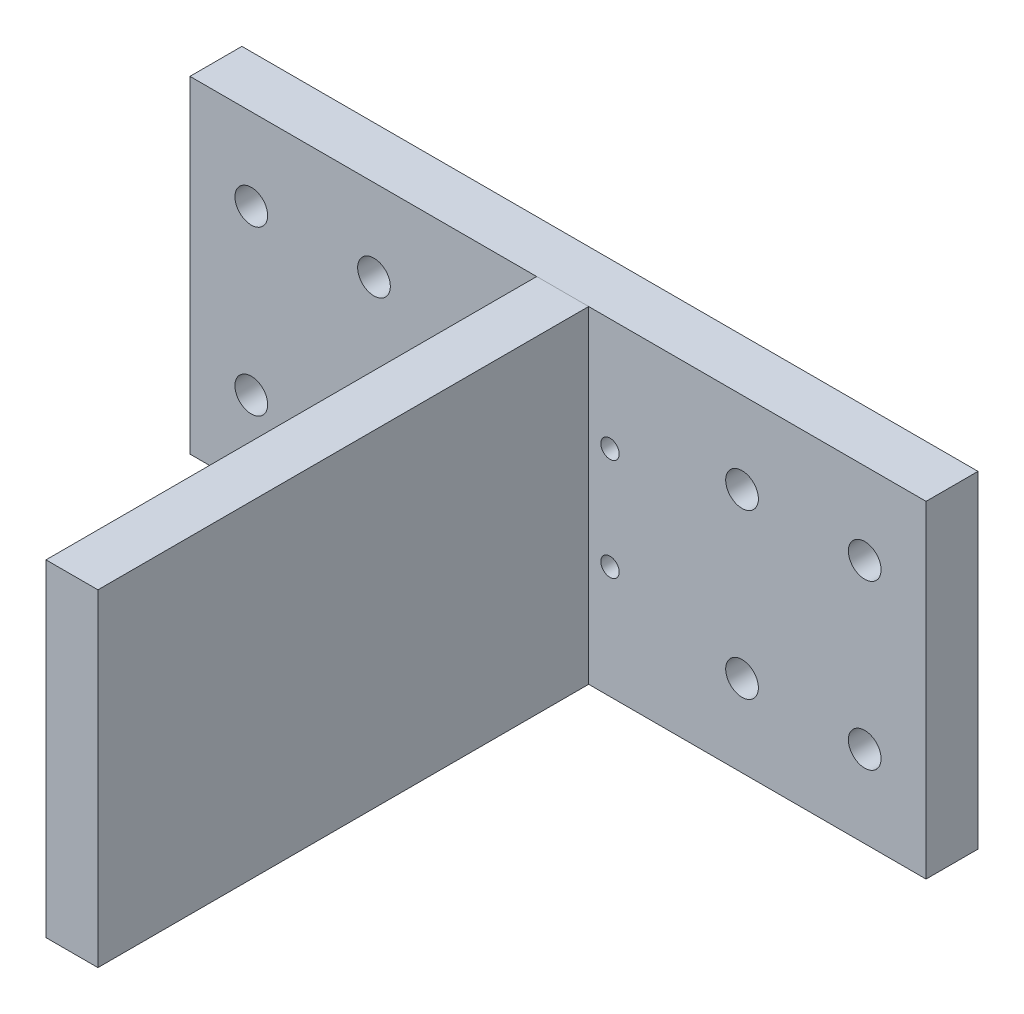
ISO-10303-21;
HEADER;
FILE_DESCRIPTION(('STEP AP214'),'2;1');
FILE_NAME('part.step','',(''),(''),'','','');
FILE_SCHEMA(('AUTOMOTIVE_DESIGN { 1 0 10303 214 1 1 1 1 }'));
ENDSEC;
DATA;
#1=APPLICATION_CONTEXT('core data for automotive mechanical design processes');
#2=APPLICATION_PROTOCOL_DEFINITION('international standard','automotive_design',2000,#1);
#3=PRODUCT_CONTEXT('',#1,'mechanical');
#4=PRODUCT('Part','Part','',(#3));
#5=PRODUCT_RELATED_PRODUCT_CATEGORY('part','',(#4));
#6=PRODUCT_DEFINITION_FORMATION('','',#4);
#7=PRODUCT_DEFINITION_CONTEXT('part definition',#1,'design');
#8=PRODUCT_DEFINITION('design','',#6,#7);
#9=PRODUCT_DEFINITION_SHAPE('','',#8);
#10=(LENGTH_UNIT() NAMED_UNIT(*) SI_UNIT(.MILLI.,.METRE.));
#11=(NAMED_UNIT(*) PLANE_ANGLE_UNIT() SI_UNIT($,.RADIAN.));
#12=(NAMED_UNIT(*) SI_UNIT($,.STERADIAN.) SOLID_ANGLE_UNIT());
#13=UNCERTAINTY_MEASURE_WITH_UNIT(LENGTH_MEASURE(1.E-05),#10,'distance_accuracy_value','');
#14=(GEOMETRIC_REPRESENTATION_CONTEXT(3) GLOBAL_UNCERTAINTY_ASSIGNED_CONTEXT((#13)) GLOBAL_UNIT_ASSIGNED_CONTEXT((#10,
#11,#12)) REPRESENTATION_CONTEXT('',''));
#15=CARTESIAN_POINT('',(0.,0.,0.));
#16=DIRECTION('',(0.,0.,1.));
#17=DIRECTION('',(1.,0.,0.));
#18=AXIS2_PLACEMENT_3D('',#15,#16,#17);
#19=CARTESIAN_POINT('',(0.,0.,12.7));
#20=DIRECTION('',(0.,0.,1.));
#21=DIRECTION('',(1.,0.,0.));
#22=AXIS2_PLACEMENT_3D('',#19,#20,#21);
#23=PLANE('',#22);
#24=DIRECTION('',(0.,1.,0.));
#25=VECTOR('',#24,1.);
#26=CARTESIAN_POINT('',(-52.5000000000002,80.0112048837684,12.7));
#27=LINE('',#26,#25);
#28=CARTESIAN_POINT('',(-52.5000000000002,0.,12.7));
#29=VERTEX_POINT('',#28);
#30=CARTESIAN_POINT('',(-52.5000000000002,80.0000000000001,12.7));
#31=VERTEX_POINT('',#30);
#32=EDGE_CURVE('E261',#29,#31,#27,.T.);
#33=ORIENTED_EDGE('',*,*,#32,.F.);
#34=DIRECTION('',(-1.,0.,0.));
#35=VECTOR('',#34,1.);
#36=CARTESIAN_POINT('',(0.,0.,12.7));
#37=LINE('',#36,#35);
#38=CARTESIAN_POINT('',(30.,0.,12.7));
#39=VERTEX_POINT('',#38);
#40=EDGE_CURVE('E183',#39,#29,#37,.T.);
#41=ORIENTED_EDGE('',*,*,#40,.F.);
#42=DIRECTION('',(0.,1.,0.));
#43=VECTOR('',#42,1.);
#44=CARTESIAN_POINT('',(30.,0.,12.7));
#45=LINE('',#44,#43);
#46=CARTESIAN_POINT('',(30.,80.0000000000001,12.7));
#47=VERTEX_POINT('',#46);
#48=EDGE_CURVE('E186',#39,#47,#45,.T.);
#49=ORIENTED_EDGE('',*,*,#48,.T.);
#50=DIRECTION('',(-1.,0.,0.));
#51=VECTOR('',#50,1.);
#52=CARTESIAN_POINT('',(0.,80.0000000000001,12.7));
#53=LINE('',#52,#51);
#54=EDGE_CURVE('E190',#47,#31,#53,.T.);
#55=ORIENTED_EDGE('',*,*,#54,.T.);
#56=EDGE_LOOP('',(#33,#41,#49,#55));
#57=FACE_BOUND('',#56,.T.);
#58=CARTESIAN_POINT('',(-47.2884854155485,27.5,12.7));
#59=DIRECTION('',(0.,0.,1.));
#60=DIRECTION('',(1.,0.,0.));
#61=AXIS2_PLACEMENT_3D('',#58,#59,#60);
#62=CIRCLE('',#61,2.25);
#63=CARTESIAN_POINT('',(-45.0384854155485,27.5,12.7));
#64=VERTEX_POINT('',#63);
#65=EDGE_CURVE('E176',#64,#64,#62,.T.);
#66=ORIENTED_EDGE('',*,*,#65,.F.);
#67=EDGE_LOOP('',(#66));
#68=FACE_BOUND('',#67,.T.);
#69=CARTESIAN_POINT('',(-47.2884854155485,52.5,12.7));
#70=DIRECTION('',(0.,0.,1.));
#71=DIRECTION('',(1.,0.,0.));
#72=AXIS2_PLACEMENT_3D('',#69,#70,#71);
#73=CIRCLE('',#72,2.25000000000001);
#74=CARTESIAN_POINT('',(-45.0384854155485,52.5,12.7));
#75=VERTEX_POINT('',#74);
#76=EDGE_CURVE('E173',#75,#75,#73,.T.);
#77=ORIENTED_EDGE('',*,*,#76,.F.);
#78=EDGE_LOOP('',(#77));
#79=FACE_BOUND('',#78,.T.);
#80=CARTESIAN_POINT('',(-15.,60.,12.7));
#81=DIRECTION('',(0.,0.,1.));
#82=DIRECTION('',(1.,0.,0.));
#83=AXIS2_PLACEMENT_3D('',#80,#81,#82);
#84=CIRCLE('',#83,4.);
#85=CARTESIAN_POINT('',(-11.,60.,12.7));
#86=VERTEX_POINT('',#85);
#87=EDGE_CURVE('E152',#86,#86,#84,.T.);
#88=ORIENTED_EDGE('',*,*,#87,.F.);
#89=EDGE_LOOP('',(#88));
#90=FACE_BOUND('',#89,.T.);
#91=CARTESIAN_POINT('',(15.,60.0000000000001,12.7));
#92=DIRECTION('',(0.,0.,1.));
#93=DIRECTION('',(1.,0.,0.));
#94=AXIS2_PLACEMENT_3D('',#91,#92,#93);
#95=CIRCLE('',#94,3.99999999999999);
#96=CARTESIAN_POINT('',(19.,60.0000000000001,12.7));
#97=VERTEX_POINT('',#96);
#98=EDGE_CURVE('E149',#97,#97,#95,.T.);
#99=ORIENTED_EDGE('',*,*,#98,.F.);
#100=EDGE_LOOP('',(#99));
#101=FACE_BOUND('',#100,.T.);
#102=CARTESIAN_POINT('',(-15.,20.0000000000001,12.7));
#103=DIRECTION('',(0.,0.,1.));
#104=DIRECTION('',(1.,0.,0.));
#105=AXIS2_PLACEMENT_3D('',#102,#103,#104);
#106=CIRCLE('',#105,4.);
#107=CARTESIAN_POINT('',(-11.,20.0000000000001,12.7));
#108=VERTEX_POINT('',#107);
#109=EDGE_CURVE('E145',#108,#108,#106,.T.);
#110=ORIENTED_EDGE('',*,*,#109,.F.);
#111=EDGE_LOOP('',(#110));
#112=FACE_BOUND('',#111,.T.);
#113=CARTESIAN_POINT('',(15.,20.0000000000001,12.7));
#114=DIRECTION('',(0.,0.,1.));
#115=DIRECTION('',(1.,0.,0.));
#116=AXIS2_PLACEMENT_3D('',#113,#114,#115);
#117=CIRCLE('',#116,4.);
#118=CARTESIAN_POINT('',(19.,20.0000000000001,12.7));
#119=VERTEX_POINT('',#118);
#120=EDGE_CURVE('E142',#119,#119,#117,.T.);
#121=ORIENTED_EDGE('',*,*,#120,.F.);
#122=EDGE_LOOP('',(#121));
#123=FACE_BOUND('',#122,.T.);
#124=ADVANCED_FACE('F37',(#57,#68,#79,#90,#101,#112,#123),#23,.T.);
#125=CARTESIAN_POINT('',(-150.,0.,12.7));
#126=DIRECTION('',(-1.,0.,0.));
#127=DIRECTION('',(0.,0.,1.));
#128=AXIS2_PLACEMENT_3D('',#125,#126,#127);
#129=PLANE('',#128);
#130=DIRECTION('',(0.,1.,0.));
#131=VECTOR('',#130,1.);
#132=CARTESIAN_POINT('',(-150.,0.,0.));
#133=LINE('',#132,#131);
#134=CARTESIAN_POINT('',(-150.,0.,0.));
#135=VERTEX_POINT('',#134);
#136=CARTESIAN_POINT('',(-150.,80.0000000000001,0.));
#137=VERTEX_POINT('',#136);
#138=EDGE_CURVE('E225',#135,#137,#133,.T.);
#139=ORIENTED_EDGE('',*,*,#138,.F.);
#140=DIRECTION('',(0.,0.,-1.));
#141=VECTOR('',#140,1.);
#142=CARTESIAN_POINT('',(-150.,0.,12.7));
#143=LINE('',#142,#141);
#144=CARTESIAN_POINT('',(-150.,0.,12.7));
#145=VERTEX_POINT('',#144);
#146=EDGE_CURVE('E41',#145,#135,#143,.T.);
#147=ORIENTED_EDGE('',*,*,#146,.F.);
#148=DIRECTION('',(0.,1.,0.));
#149=VECTOR('',#148,1.);
#150=CARTESIAN_POINT('',(-150.,0.,12.7));
#151=LINE('',#150,#149);
#152=CARTESIAN_POINT('',(-150.,80.0000000000001,12.7));
#153=VERTEX_POINT('',#152);
#154=EDGE_CURVE('E179',#145,#153,#151,.T.);
#155=ORIENTED_EDGE('',*,*,#154,.T.);
#156=DIRECTION('',(0.,0.,-1.));
#157=VECTOR('',#156,1.);
#158=CARTESIAN_POINT('',(-150.,80.0000000000001,12.7));
#159=LINE('',#158,#157);
#160=EDGE_CURVE('E191',#153,#137,#159,.T.);
#161=ORIENTED_EDGE('',*,*,#160,.T.);
#162=EDGE_LOOP('',(#139,#147,#155,#161));
#163=FACE_BOUND('',#162,.T.);
#164=ADVANCED_FACE('F251',(#163),#129,.T.);
#165=CARTESIAN_POINT('',(0.,0.,12.7));
#166=DIRECTION('',(0.,-1.,0.));
#167=DIRECTION('',(0.,0.,-1.));
#168=AXIS2_PLACEMENT_3D('',#165,#166,#167);
#169=PLANE('',#168);
#170=DIRECTION('',(-1.,0.,0.));
#171=VECTOR('',#170,1.);
#172=CARTESIAN_POINT('',(0.,0.,0.));
#173=LINE('',#172,#171);
#174=CARTESIAN_POINT('',(30.,0.,0.));
#175=VERTEX_POINT('',#174);
#176=EDGE_CURVE('E228',#175,#135,#173,.T.);
#177=ORIENTED_EDGE('',*,*,#176,.F.);
#178=DIRECTION('',(0.,0.,-1.));
#179=VECTOR('',#178,1.);
#180=CARTESIAN_POINT('',(30.,0.,12.7));
#181=LINE('',#180,#179);
#182=EDGE_CURVE('E239',#39,#175,#181,.T.);
#183=ORIENTED_EDGE('',*,*,#182,.F.);
#184=ORIENTED_EDGE('',*,*,#40,.T.);
#185=DIRECTION('',(0.,0.,-1.));
#186=VECTOR('',#185,1.);
#187=CARTESIAN_POINT('',(-52.5000000000002,0.,132.7));
#188=LINE('',#187,#186);
#189=CARTESIAN_POINT('',(-52.5000000000002,0.,132.7));
#190=VERTEX_POINT('',#189);
#191=EDGE_CURVE('E262',#190,#29,#188,.T.);
#192=ORIENTED_EDGE('',*,*,#191,.F.);
#193=DIRECTION('',(1.,0.,0.));
#194=VECTOR('',#193,1.);
#195=CARTESIAN_POINT('',(-65.2000000000002,0.,132.7));
#196=LINE('',#195,#194);
#197=CARTESIAN_POINT('',(-65.2000000000002,0.,132.7));
#198=VERTEX_POINT('',#197);
#199=EDGE_CURVE('E123',#198,#190,#196,.T.);
#200=ORIENTED_EDGE('',*,*,#199,.F.);
#201=DIRECTION('',(0.,0.,-1.));
#202=VECTOR('',#201,1.);
#203=CARTESIAN_POINT('',(-65.2000000000002,0.,132.7));
#204=LINE('',#203,#202);
#205=CARTESIAN_POINT('',(-65.2000000000002,0.,12.7));
#206=VERTEX_POINT('',#205);
#207=EDGE_CURVE('E138',#198,#206,#204,.T.);
#208=ORIENTED_EDGE('',*,*,#207,.T.);
#209=EDGE_CURVE('E182',#206,#145,#37,.T.);
#210=ORIENTED_EDGE('',*,*,#209,.T.);
#211=ORIENTED_EDGE('',*,*,#146,.T.);
#212=EDGE_LOOP('',(#177,#183,#184,#192,#200,#208,#210,#211));
#213=FACE_BOUND('',#212,.T.);
#214=ADVANCED_FACE('F247',(#213),#169,.T.);
#215=CARTESIAN_POINT('',(30.,0.,12.7));
#216=DIRECTION('',(-1.,0.,0.));
#217=DIRECTION('',(0.,0.,1.));
#218=AXIS2_PLACEMENT_3D('',#215,#216,#217);
#219=PLANE('',#218);
#220=DIRECTION('',(0.,1.,0.));
#221=VECTOR('',#220,1.);
#222=CARTESIAN_POINT('',(30.,0.,0.));
#223=LINE('',#222,#221);
#224=CARTESIAN_POINT('',(30.,80.0000000000001,0.));
#225=VERTEX_POINT('',#224);
#226=EDGE_CURVE('E231',#175,#225,#223,.T.);
#227=ORIENTED_EDGE('',*,*,#226,.T.);
#228=DIRECTION('',(0.,0.,-1.));
#229=VECTOR('',#228,1.);
#230=CARTESIAN_POINT('',(30.,80.0000000000001,12.7));
#231=LINE('',#230,#229);
#232=EDGE_CURVE('E237',#47,#225,#231,.T.);
#233=ORIENTED_EDGE('',*,*,#232,.F.);
#234=ORIENTED_EDGE('',*,*,#48,.F.);
#235=ORIENTED_EDGE('',*,*,#182,.T.);
#236=EDGE_LOOP('',(#227,#233,#234,#235));
#237=FACE_BOUND('',#236,.T.);
#238=ADVANCED_FACE('F256',(#237),#219,.F.);
#239=CARTESIAN_POINT('',(-47.2884854155485,27.5,12.7));
#240=DIRECTION('',(0.,0.,-1.));
#241=DIRECTION('',(-1.,0.,0.));
#242=AXIS2_PLACEMENT_3D('',#239,#240,#241);
#243=CYLINDRICAL_SURFACE('',#242,2.25);
#244=ORIENTED_EDGE('',*,*,#65,.T.);
#245=EDGE_LOOP('',(#244));
#246=FACE_BOUND('',#245,.T.);
#247=CARTESIAN_POINT('',(-47.2884854155485,27.5,0.));
#248=DIRECTION('',(0.,0.,1.));
#249=DIRECTION('',(1.,0.,0.));
#250=AXIS2_PLACEMENT_3D('',#247,#248,#249);
#251=CIRCLE('',#250,2.25);
#252=CARTESIAN_POINT('',(-45.0384854155485,27.5,0.));
#253=VERTEX_POINT('',#252);
#254=EDGE_CURVE('E222',#253,#253,#251,.T.);
#255=ORIENTED_EDGE('',*,*,#254,.F.);
#256=EDGE_LOOP('',(#255));
#257=FACE_BOUND('',#256,.T.);
#258=ADVANCED_FACE('F308',(#246,#257),#243,.F.);
#259=CARTESIAN_POINT('',(-47.2884854155485,52.5,12.7));
#260=DIRECTION('',(0.,0.,-1.));
#261=DIRECTION('',(-1.,0.,0.));
#262=AXIS2_PLACEMENT_3D('',#259,#260,#261);
#263=CYLINDRICAL_SURFACE('',#262,2.25000000000001);
#264=ORIENTED_EDGE('',*,*,#76,.T.);
#265=EDGE_LOOP('',(#264));
#266=FACE_BOUND('',#265,.T.);
#267=CARTESIAN_POINT('',(-47.2884854155485,52.5,0.));
#268=DIRECTION('',(0.,0.,1.));
#269=DIRECTION('',(1.,0.,0.));
#270=AXIS2_PLACEMENT_3D('',#267,#268,#269);
#271=CIRCLE('',#270,2.25000000000001);
#272=CARTESIAN_POINT('',(-45.0384854155485,52.5,0.));
#273=VERTEX_POINT('',#272);
#274=EDGE_CURVE('E219',#273,#273,#271,.T.);
#275=ORIENTED_EDGE('',*,*,#274,.F.);
#276=EDGE_LOOP('',(#275));
#277=FACE_BOUND('',#276,.T.);
#278=ADVANCED_FACE('F296',(#266,#277),#263,.F.);
#279=CARTESIAN_POINT('',(-72.2884854155485,52.5,12.7));
#280=DIRECTION('',(0.,0.,-1.));
#281=DIRECTION('',(-1.,0.,0.));
#282=AXIS2_PLACEMENT_3D('',#279,#280,#281);
#283=CYLINDRICAL_SURFACE('',#282,2.25);
#284=CARTESIAN_POINT('',(-72.2884854155485,52.5,12.7));
#285=DIRECTION('',(0.,0.,1.));
#286=DIRECTION('',(1.,0.,0.));
#287=AXIS2_PLACEMENT_3D('',#284,#285,#286);
#288=CIRCLE('',#287,2.25);
#289=CARTESIAN_POINT('',(-70.0384854155485,52.5,12.7));
#290=VERTEX_POINT('',#289);
#291=EDGE_CURVE('E170',#290,#290,#288,.T.);
#292=ORIENTED_EDGE('',*,*,#291,.T.);
#293=EDGE_LOOP('',(#292));
#294=FACE_BOUND('',#293,.T.);
#295=CARTESIAN_POINT('',(-72.2884854155485,52.5,0.));
#296=DIRECTION('',(0.,0.,1.));
#297=DIRECTION('',(1.,0.,0.));
#298=AXIS2_PLACEMENT_3D('',#295,#296,#297);
#299=CIRCLE('',#298,2.25);
#300=CARTESIAN_POINT('',(-70.0384854155485,52.5,0.));
#301=VERTEX_POINT('',#300);
#302=EDGE_CURVE('E216',#301,#301,#299,.T.);
#303=ORIENTED_EDGE('',*,*,#302,.F.);
#304=EDGE_LOOP('',(#303));
#305=FACE_BOUND('',#304,.T.);
#306=ADVANCED_FACE('F292',(#294,#305),#283,.F.);
#307=CARTESIAN_POINT('',(-72.2884854155485,27.5,12.7));
#308=DIRECTION('',(0.,0.,-1.));
#309=DIRECTION('',(-1.,0.,0.));
#310=AXIS2_PLACEMENT_3D('',#307,#308,#309);
#311=CYLINDRICAL_SURFACE('',#310,2.25);
#312=CARTESIAN_POINT('',(-72.2884854155485,27.5,12.7));
#313=DIRECTION('',(0.,0.,1.));
#314=DIRECTION('',(1.,0.,0.));
#315=AXIS2_PLACEMENT_3D('',#312,#313,#314);
#316=CIRCLE('',#315,2.25);
#317=CARTESIAN_POINT('',(-70.0384854155485,27.5,12.7));
#318=VERTEX_POINT('',#317);
#319=EDGE_CURVE('E167',#318,#318,#316,.T.);
#320=ORIENTED_EDGE('',*,*,#319,.T.);
#321=EDGE_LOOP('',(#320));
#322=FACE_BOUND('',#321,.T.);
#323=CARTESIAN_POINT('',(-72.2884854155485,27.5,0.));
#324=DIRECTION('',(0.,0.,1.));
#325=DIRECTION('',(1.,0.,0.));
#326=AXIS2_PLACEMENT_3D('',#323,#324,#325);
#327=CIRCLE('',#326,2.25);
#328=CARTESIAN_POINT('',(-70.0384854155485,27.5,0.));
#329=VERTEX_POINT('',#328);
#330=EDGE_CURVE('E213',#329,#329,#327,.T.);
#331=ORIENTED_EDGE('',*,*,#330,.F.);
#332=EDGE_LOOP('',(#331));
#333=FACE_BOUND('',#332,.T.);
#334=ADVANCED_FACE('F295',(#322,#333),#311,.F.);
#335=CARTESIAN_POINT('',(-105.,60.0000000000001,12.7));
#336=DIRECTION('',(0.,0.,-1.));
#337=DIRECTION('',(-1.,0.,0.));
#338=AXIS2_PLACEMENT_3D('',#335,#336,#337);
#339=CYLINDRICAL_SURFACE('',#338,3.99999999999999);
#340=CARTESIAN_POINT('',(-105.,60.0000000000001,12.7));
#341=DIRECTION('',(0.,0.,1.));
#342=DIRECTION('',(1.,0.,0.));
#343=AXIS2_PLACEMENT_3D('',#340,#341,#342);
#344=CIRCLE('',#343,3.99999999999999);
#345=CARTESIAN_POINT('',(-101.,60.0000000000001,12.7));
#346=VERTEX_POINT('',#345);
#347=EDGE_CURVE('E164',#346,#346,#344,.T.);
#348=ORIENTED_EDGE('',*,*,#347,.T.);
#349=EDGE_LOOP('',(#348));
#350=FACE_BOUND('',#349,.T.);
#351=CARTESIAN_POINT('',(-105.,60.0000000000001,0.));
#352=DIRECTION('',(0.,0.,1.));
#353=DIRECTION('',(1.,0.,0.));
#354=AXIS2_PLACEMENT_3D('',#351,#352,#353);
#355=CIRCLE('',#354,3.99999999999999);
#356=CARTESIAN_POINT('',(-101.,60.0000000000001,0.));
#357=VERTEX_POINT('',#356);
#358=EDGE_CURVE('E210',#357,#357,#355,.T.);
#359=ORIENTED_EDGE('',*,*,#358,.F.);
#360=EDGE_LOOP('',(#359));
#361=FACE_BOUND('',#360,.T.);
#362=ADVANCED_FACE('F367',(#350,#361),#339,.F.);
#363=CARTESIAN_POINT('',(-135.,60.,12.7));
#364=DIRECTION('',(0.,0.,-1.));
#365=DIRECTION('',(-1.,0.,0.));
#366=AXIS2_PLACEMENT_3D('',#363,#364,#365);
#367=CYLINDRICAL_SURFACE('',#366,3.99999999999999);
#368=CARTESIAN_POINT('',(-135.,60.,12.7));
#369=DIRECTION('',(0.,0.,1.));
#370=DIRECTION('',(1.,0.,0.));
#371=AXIS2_PLACEMENT_3D('',#368,#369,#370);
#372=CIRCLE('',#371,3.99999999999999);
#373=CARTESIAN_POINT('',(-131.,60.,12.7));
#374=VERTEX_POINT('',#373);
#375=EDGE_CURVE('E161',#374,#374,#372,.T.);
#376=ORIENTED_EDGE('',*,*,#375,.T.);
#377=EDGE_LOOP('',(#376));
#378=FACE_BOUND('',#377,.T.);
#379=CARTESIAN_POINT('',(-135.,60.,0.));
#380=DIRECTION('',(0.,0.,1.));
#381=DIRECTION('',(1.,0.,0.));
#382=AXIS2_PLACEMENT_3D('',#379,#380,#381);
#383=CIRCLE('',#382,3.99999999999999);
#384=CARTESIAN_POINT('',(-131.,60.,0.));
#385=VERTEX_POINT('',#384);
#386=EDGE_CURVE('E207',#385,#385,#383,.T.);
#387=ORIENTED_EDGE('',*,*,#386,.F.);
#388=EDGE_LOOP('',(#387));
#389=FACE_BOUND('',#388,.T.);
#390=ADVANCED_FACE('F377',(#378,#389),#367,.F.);
#391=CARTESIAN_POINT('',(-135.,20.0000000000001,12.7));
#392=DIRECTION('',(0.,0.,-1.));
#393=DIRECTION('',(-1.,0.,0.));
#394=AXIS2_PLACEMENT_3D('',#391,#392,#393);
#395=CYLINDRICAL_SURFACE('',#394,3.99999999999999);
#396=CARTESIAN_POINT('',(-135.,20.0000000000001,12.7));
#397=DIRECTION('',(0.,0.,1.));
#398=DIRECTION('',(1.,0.,0.));
#399=AXIS2_PLACEMENT_3D('',#396,#397,#398);
#400=CIRCLE('',#399,3.99999999999999);
#401=CARTESIAN_POINT('',(-131.,20.0000000000001,12.7));
#402=VERTEX_POINT('',#401);
#403=EDGE_CURVE('E158',#402,#402,#400,.T.);
#404=ORIENTED_EDGE('',*,*,#403,.T.);
#405=EDGE_LOOP('',(#404));
#406=FACE_BOUND('',#405,.T.);
#407=CARTESIAN_POINT('',(-135.,20.0000000000001,0.));
#408=DIRECTION('',(0.,0.,1.));
#409=DIRECTION('',(1.,0.,0.));
#410=AXIS2_PLACEMENT_3D('',#407,#408,#409);
#411=CIRCLE('',#410,3.99999999999999);
#412=CARTESIAN_POINT('',(-131.,20.0000000000001,0.));
#413=VERTEX_POINT('',#412);
#414=EDGE_CURVE('E204',#413,#413,#411,.T.);
#415=ORIENTED_EDGE('',*,*,#414,.F.);
#416=EDGE_LOOP('',(#415));
#417=FACE_BOUND('',#416,.T.);
#418=ADVANCED_FACE('F387',(#406,#417),#395,.F.);
#419=CARTESIAN_POINT('',(-105.,20.0000000000001,12.7));
#420=DIRECTION('',(0.,0.,-1.));
#421=DIRECTION('',(-1.,0.,0.));
#422=AXIS2_PLACEMENT_3D('',#419,#420,#421);
#423=CYLINDRICAL_SURFACE('',#422,4.00000000000001);
#424=CARTESIAN_POINT('',(-105.,20.0000000000001,12.7));
#425=DIRECTION('',(0.,0.,1.));
#426=DIRECTION('',(1.,0.,0.));
#427=AXIS2_PLACEMENT_3D('',#424,#425,#426);
#428=CIRCLE('',#427,4.00000000000001);
#429=CARTESIAN_POINT('',(-101.,20.0000000000001,12.7));
#430=VERTEX_POINT('',#429);
#431=EDGE_CURVE('E155',#430,#430,#428,.T.);
#432=ORIENTED_EDGE('',*,*,#431,.T.);
#433=EDGE_LOOP('',(#432));
#434=FACE_BOUND('',#433,.T.);
#435=CARTESIAN_POINT('',(-105.,20.0000000000001,0.));
#436=DIRECTION('',(0.,0.,1.));
#437=DIRECTION('',(1.,0.,0.));
#438=AXIS2_PLACEMENT_3D('',#435,#436,#437);
#439=CIRCLE('',#438,4.00000000000001);
#440=CARTESIAN_POINT('',(-101.,20.0000000000001,0.));
#441=VERTEX_POINT('',#440);
#442=EDGE_CURVE('E201',#441,#441,#439,.T.);
#443=ORIENTED_EDGE('',*,*,#442,.F.);
#444=EDGE_LOOP('',(#443));
#445=FACE_BOUND('',#444,.T.);
#446=ADVANCED_FACE('F397',(#434,#445),#423,.F.);
#447=CARTESIAN_POINT('',(-15.,60.,12.7));
#448=DIRECTION('',(0.,0.,-1.));
#449=DIRECTION('',(-1.,0.,0.));
#450=AXIS2_PLACEMENT_3D('',#447,#448,#449);
#451=CYLINDRICAL_SURFACE('',#450,4.);
#452=ORIENTED_EDGE('',*,*,#87,.T.);
#453=EDGE_LOOP('',(#452));
#454=FACE_BOUND('',#453,.T.);
#455=CARTESIAN_POINT('',(-15.,60.,0.));
#456=DIRECTION('',(0.,0.,1.));
#457=DIRECTION('',(1.,0.,0.));
#458=AXIS2_PLACEMENT_3D('',#455,#456,#457);
#459=CIRCLE('',#458,4.);
#460=CARTESIAN_POINT('',(-11.,60.,0.));
#461=VERTEX_POINT('',#460);
#462=EDGE_CURVE('E198',#461,#461,#459,.T.);
#463=ORIENTED_EDGE('',*,*,#462,.F.);
#464=EDGE_LOOP('',(#463));
#465=FACE_BOUND('',#464,.T.);
#466=ADVANCED_FACE('F407',(#454,#465),#451,.F.);
#467=CARTESIAN_POINT('',(15.,60.0000000000001,12.7));
#468=DIRECTION('',(0.,0.,-1.));
#469=DIRECTION('',(-1.,0.,0.));
#470=AXIS2_PLACEMENT_3D('',#467,#468,#469);
#471=CYLINDRICAL_SURFACE('',#470,3.99999999999999);
#472=ORIENTED_EDGE('',*,*,#98,.T.);
#473=EDGE_LOOP('',(#472));
#474=FACE_BOUND('',#473,.T.);
#475=CARTESIAN_POINT('',(15.,60.0000000000001,0.));
#476=DIRECTION('',(0.,0.,1.));
#477=DIRECTION('',(1.,0.,0.));
#478=AXIS2_PLACEMENT_3D('',#475,#476,#477);
#479=CIRCLE('',#478,3.99999999999999);
#480=CARTESIAN_POINT('',(19.,60.0000000000001,0.));
#481=VERTEX_POINT('',#480);
#482=EDGE_CURVE('E195',#481,#481,#479,.T.);
#483=ORIENTED_EDGE('',*,*,#482,.F.);
#484=EDGE_LOOP('',(#483));
#485=FACE_BOUND('',#484,.T.);
#486=ADVANCED_FACE('F417',(#474,#485),#471,.F.);
#487=CARTESIAN_POINT('',(-15.,20.0000000000001,12.7));
#488=DIRECTION('',(0.,0.,-1.));
#489=DIRECTION('',(-1.,0.,0.));
#490=AXIS2_PLACEMENT_3D('',#487,#488,#489);
#491=CYLINDRICAL_SURFACE('',#490,4.);
#492=ORIENTED_EDGE('',*,*,#109,.T.);
#493=EDGE_LOOP('',(#492));
#494=FACE_BOUND('',#493,.T.);
#495=CARTESIAN_POINT('',(-15.,20.0000000000001,0.));
#496=DIRECTION('',(0.,0.,1.));
#497=DIRECTION('',(1.,0.,0.));
#498=AXIS2_PLACEMENT_3D('',#495,#496,#497);
#499=CIRCLE('',#498,4.);
#500=CARTESIAN_POINT('',(-11.,20.0000000000001,0.));
#501=VERTEX_POINT('',#500);
#502=EDGE_CURVE('E136',#501,#501,#499,.T.);
#503=ORIENTED_EDGE('',*,*,#502,.F.);
#504=EDGE_LOOP('',(#503));
#505=FACE_BOUND('',#504,.T.);
#506=ADVANCED_FACE('F427',(#494,#505),#491,.F.);
#507=CARTESIAN_POINT('',(15.,20.0000000000001,12.7));
#508=DIRECTION('',(0.,0.,-1.));
#509=DIRECTION('',(-1.,0.,0.));
#510=AXIS2_PLACEMENT_3D('',#507,#508,#509);
#511=CYLINDRICAL_SURFACE('',#510,4.);
#512=ORIENTED_EDGE('',*,*,#120,.T.);
#513=EDGE_LOOP('',(#512));
#514=FACE_BOUND('',#513,.T.);
#515=CARTESIAN_POINT('',(15.,20.0000000000001,0.));
#516=DIRECTION('',(0.,0.,1.));
#517=DIRECTION('',(1.,0.,0.));
#518=AXIS2_PLACEMENT_3D('',#515,#516,#517);
#519=CIRCLE('',#518,4.);
#520=CARTESIAN_POINT('',(19.,20.0000000000001,0.));
#521=VERTEX_POINT('',#520);
#522=EDGE_CURVE('E133',#521,#521,#519,.T.);
#523=ORIENTED_EDGE('',*,*,#522,.F.);
#524=EDGE_LOOP('',(#523));
#525=FACE_BOUND('',#524,.T.);
#526=ADVANCED_FACE('F39',(#514,#525),#511,.F.);
#527=CARTESIAN_POINT('',(0.,80.0000000000001,12.7));
#528=DIRECTION('',(0.,-1.,0.));
#529=DIRECTION('',(0.,0.,-1.));
#530=AXIS2_PLACEMENT_3D('',#527,#528,#529);
#531=PLANE('',#530);
#532=DIRECTION('',(-1.,0.,0.));
#533=VECTOR('',#532,1.);
#534=CARTESIAN_POINT('',(0.,80.0000000000001,0.));
#535=LINE('',#534,#533);
#536=EDGE_CURVE('E146',#225,#137,#535,.T.);
#537=ORIENTED_EDGE('',*,*,#536,.T.);
#538=ORIENTED_EDGE('',*,*,#160,.F.);
#539=CARTESIAN_POINT('',(-65.2000000000002,80.0000000000001,12.7));
#540=VERTEX_POINT('',#539);
#541=EDGE_CURVE('E189',#540,#153,#53,.T.);
#542=ORIENTED_EDGE('',*,*,#541,.F.);
#543=EDGE_CURVE('E59',#31,#540,#53,.T.);
#544=ORIENTED_EDGE('',*,*,#543,.F.);
#545=ORIENTED_EDGE('',*,*,#54,.F.);
#546=ORIENTED_EDGE('',*,*,#232,.T.);
#547=EDGE_LOOP('',(#537,#538,#542,#544,#545,#546));
#548=FACE_BOUND('',#547,.T.);
#549=ADVANCED_FACE('F258',(#548),#531,.F.);
#550=DIRECTION('',(0.,-1.,0.));
#551=VECTOR('',#550,1.);
#552=CARTESIAN_POINT('',(-65.2000000000002,80.0112048837684,12.7));
#553=LINE('',#552,#551);
#554=EDGE_CURVE('E11',#540,#206,#553,.T.);
#555=ORIENTED_EDGE('',*,*,#554,.F.);
#556=ORIENTED_EDGE('',*,*,#541,.T.);
#557=ORIENTED_EDGE('',*,*,#154,.F.);
#558=ORIENTED_EDGE('',*,*,#209,.F.);
#559=EDGE_LOOP('',(#555,#556,#557,#558));
#560=FACE_BOUND('',#559,.T.);
#561=ORIENTED_EDGE('',*,*,#431,.F.);
#562=EDGE_LOOP('',(#561));
#563=FACE_BOUND('',#562,.T.);
#564=ORIENTED_EDGE('',*,*,#403,.F.);
#565=EDGE_LOOP('',(#564));
#566=FACE_BOUND('',#565,.T.);
#567=ORIENTED_EDGE('',*,*,#375,.F.);
#568=EDGE_LOOP('',(#567));
#569=FACE_BOUND('',#568,.T.);
#570=ORIENTED_EDGE('',*,*,#347,.F.);
#571=EDGE_LOOP('',(#570));
#572=FACE_BOUND('',#571,.T.);
#573=ORIENTED_EDGE('',*,*,#319,.F.);
#574=EDGE_LOOP('',(#573));
#575=FACE_BOUND('',#574,.T.);
#576=ORIENTED_EDGE('',*,*,#291,.F.);
#577=EDGE_LOOP('',(#576));
#578=FACE_BOUND('',#577,.T.);
#579=ADVANCED_FACE('F276',(#560,#563,#566,#569,#572,#575,#578),#23,.T.);
#580=CARTESIAN_POINT('',(0.,0.,0.));
#581=DIRECTION('',(0.,0.,1.));
#582=DIRECTION('',(1.,0.,0.));
#583=AXIS2_PLACEMENT_3D('',#580,#581,#582);
#584=PLANE('',#583);
#585=ORIENTED_EDGE('',*,*,#522,.T.);
#586=EDGE_LOOP('',(#585));
#587=FACE_BOUND('',#586,.T.);
#588=ORIENTED_EDGE('',*,*,#502,.T.);
#589=EDGE_LOOP('',(#588));
#590=FACE_BOUND('',#589,.T.);
#591=ORIENTED_EDGE('',*,*,#482,.T.);
#592=EDGE_LOOP('',(#591));
#593=FACE_BOUND('',#592,.T.);
#594=ORIENTED_EDGE('',*,*,#462,.T.);
#595=EDGE_LOOP('',(#594));
#596=FACE_BOUND('',#595,.T.);
#597=ORIENTED_EDGE('',*,*,#442,.T.);
#598=EDGE_LOOP('',(#597));
#599=FACE_BOUND('',#598,.T.);
#600=ORIENTED_EDGE('',*,*,#414,.T.);
#601=EDGE_LOOP('',(#600));
#602=FACE_BOUND('',#601,.T.);
#603=ORIENTED_EDGE('',*,*,#386,.T.);
#604=EDGE_LOOP('',(#603));
#605=FACE_BOUND('',#604,.T.);
#606=ORIENTED_EDGE('',*,*,#358,.T.);
#607=EDGE_LOOP('',(#606));
#608=FACE_BOUND('',#607,.T.);
#609=ORIENTED_EDGE('',*,*,#330,.T.);
#610=EDGE_LOOP('',(#609));
#611=FACE_BOUND('',#610,.T.);
#612=ORIENTED_EDGE('',*,*,#302,.T.);
#613=EDGE_LOOP('',(#612));
#614=FACE_BOUND('',#613,.T.);
#615=ORIENTED_EDGE('',*,*,#274,.T.);
#616=EDGE_LOOP('',(#615));
#617=FACE_BOUND('',#616,.T.);
#618=ORIENTED_EDGE('',*,*,#254,.T.);
#619=EDGE_LOOP('',(#618));
#620=FACE_BOUND('',#619,.T.);
#621=ORIENTED_EDGE('',*,*,#138,.T.);
#622=ORIENTED_EDGE('',*,*,#536,.F.);
#623=ORIENTED_EDGE('',*,*,#226,.F.);
#624=ORIENTED_EDGE('',*,*,#176,.T.);
#625=EDGE_LOOP('',(#621,#622,#623,#624));
#626=FACE_BOUND('',#625,.T.);
#627=ADVANCED_FACE('F254',(#587,#590,#593,#596,#599,#602,#605,#608,#611,#614,#617,#620,#626),
#584,.F.);
#628=CARTESIAN_POINT('',(0.,0.,12.7));
#629=DIRECTION('',(0.,0.,1.));
#630=DIRECTION('',(1.,0.,0.));
#631=AXIS2_PLACEMENT_3D('',#628,#629,#630);
#632=PLANE('',#631);
#633=CARTESIAN_POINT('',(-52.5000000000002,80.0112048837684,12.7));
#634=VERTEX_POINT('',#633);
#635=EDGE_CURVE('E131',#31,#634,#27,.T.);
#636=ORIENTED_EDGE('',*,*,#635,.F.);
#637=ORIENTED_EDGE('',*,*,#543,.T.);
#638=CARTESIAN_POINT('',(-65.2000000000002,80.0112048837684,12.7));
#639=VERTEX_POINT('',#638);
#640=EDGE_CURVE('E47',#639,#540,#553,.T.);
#641=ORIENTED_EDGE('',*,*,#640,.F.);
#642=DIRECTION('',(-1.,0.,0.));
#643=VECTOR('',#642,1.);
#644=CARTESIAN_POINT('',(-65.2000000000002,80.0112048837684,12.7));
#645=LINE('',#644,#643);
#646=EDGE_CURVE('E267',#634,#639,#645,.T.);
#647=ORIENTED_EDGE('',*,*,#646,.F.);
#648=EDGE_LOOP('',(#636,#637,#641,#647));
#649=FACE_BOUND('',#648,.T.);
#650=ADVANCED_FACE('F275',(#649),#632,.F.);
#651=CARTESIAN_POINT('',(-52.5000000000002,80.0112048837684,132.7));
#652=DIRECTION('',(-1.,0.,0.));
#653=DIRECTION('',(0.,0.,1.));
#654=AXIS2_PLACEMENT_3D('',#651,#652,#653);
#655=PLANE('',#654);
#656=ORIENTED_EDGE('',*,*,#32,.T.);
#657=ORIENTED_EDGE('',*,*,#635,.T.);
#658=DIRECTION('',(0.,0.,-1.));
#659=VECTOR('',#658,1.);
#660=CARTESIAN_POINT('',(-52.5000000000002,80.0112048837684,132.7));
#661=LINE('',#660,#659);
#662=CARTESIAN_POINT('',(-52.5000000000002,80.0112048837684,132.7));
#663=VERTEX_POINT('',#662);
#664=EDGE_CURVE('E112',#663,#634,#661,.T.);
#665=ORIENTED_EDGE('',*,*,#664,.F.);
#666=DIRECTION('',(0.,1.,0.));
#667=VECTOR('',#666,1.);
#668=CARTESIAN_POINT('',(-52.5000000000002,80.0112048837684,132.7));
#669=LINE('',#668,#667);
#670=EDGE_CURVE('E118',#190,#663,#669,.T.);
#671=ORIENTED_EDGE('',*,*,#670,.F.);
#672=ORIENTED_EDGE('',*,*,#191,.T.);
#673=EDGE_LOOP('',(#656,#657,#665,#671,#672));
#674=FACE_BOUND('',#673,.T.);
#675=ADVANCED_FACE('F129',(#674),#655,.F.);
#676=CARTESIAN_POINT('',(-65.2000000000002,80.0112048837684,132.7));
#677=DIRECTION('',(0.,-1.,0.));
#678=DIRECTION('',(1.,0.,0.));
#679=AXIS2_PLACEMENT_3D('',#676,#677,#678);
#680=PLANE('',#679);
#681=ORIENTED_EDGE('',*,*,#646,.T.);
#682=DIRECTION('',(0.,0.,-1.));
#683=VECTOR('',#682,1.);
#684=CARTESIAN_POINT('',(-65.2000000000002,80.0112048837684,132.7));
#685=LINE('',#684,#683);
#686=CARTESIAN_POINT('',(-65.2000000000002,80.0112048837684,132.7));
#687=VERTEX_POINT('',#686);
#688=EDGE_CURVE('E114',#687,#639,#685,.T.);
#689=ORIENTED_EDGE('',*,*,#688,.F.);
#690=DIRECTION('',(-1.,0.,0.));
#691=VECTOR('',#690,1.);
#692=CARTESIAN_POINT('',(-65.2000000000002,80.0112048837684,132.7));
#693=LINE('',#692,#691);
#694=EDGE_CURVE('E108',#663,#687,#693,.T.);
#695=ORIENTED_EDGE('',*,*,#694,.F.);
#696=ORIENTED_EDGE('',*,*,#664,.T.);
#697=EDGE_LOOP('',(#681,#689,#695,#696));
#698=FACE_BOUND('',#697,.T.);
#699=ADVANCED_FACE('F110',(#698),#680,.F.);
#700=CARTESIAN_POINT('',(-65.2000000000002,80.0112048837684,132.7));
#701=DIRECTION('',(1.,0.,0.));
#702=DIRECTION('',(0.,0.,-1.));
#703=AXIS2_PLACEMENT_3D('',#700,#701,#702);
#704=PLANE('',#703);
#705=ORIENTED_EDGE('',*,*,#640,.T.);
#706=ORIENTED_EDGE('',*,*,#554,.T.);
#707=ORIENTED_EDGE('',*,*,#207,.F.);
#708=DIRECTION('',(0.,-1.,0.));
#709=VECTOR('',#708,1.);
#710=CARTESIAN_POINT('',(-65.2000000000002,80.0112048837684,132.7));
#711=LINE('',#710,#709);
#712=EDGE_CURVE('E117',#687,#198,#711,.T.);
#713=ORIENTED_EDGE('',*,*,#712,.F.);
#714=ORIENTED_EDGE('',*,*,#688,.T.);
#715=EDGE_LOOP('',(#705,#706,#707,#713,#714));
#716=FACE_BOUND('',#715,.T.);
#717=ADVANCED_FACE('F272',(#716),#704,.F.);
#718=CARTESIAN_POINT('',(0.,0.,132.7));
#719=DIRECTION('',(0.,0.,1.));
#720=DIRECTION('',(1.,0.,0.));
#721=AXIS2_PLACEMENT_3D('',#718,#719,#720);
#722=PLANE('',#721);
#723=ORIENTED_EDGE('',*,*,#670,.T.);
#724=ORIENTED_EDGE('',*,*,#694,.T.);
#725=ORIENTED_EDGE('',*,*,#712,.T.);
#726=ORIENTED_EDGE('',*,*,#199,.T.);
#727=EDGE_LOOP('',(#723,#724,#725,#726));
#728=FACE_BOUND('',#727,.T.);
#729=ADVANCED_FACE('F121',(#728),#722,.T.);
#730=CLOSED_SHELL('',(#124,#164,#214,#238,#258,#278,#306,#334,#362,#390,#418,#446,#466,#486,
#506,#526,#549,#579,#627,#650,#675,#699,#717,#729));
#731=MANIFOLD_SOLID_BREP('B2',#730);
#732=ADVANCED_BREP_SHAPE_REPRESENTATION('',(#18,#731),#14);
#733=SHAPE_DEFINITION_REPRESENTATION(#9,#732);
ENDSEC;
END-ISO-10303-21;
